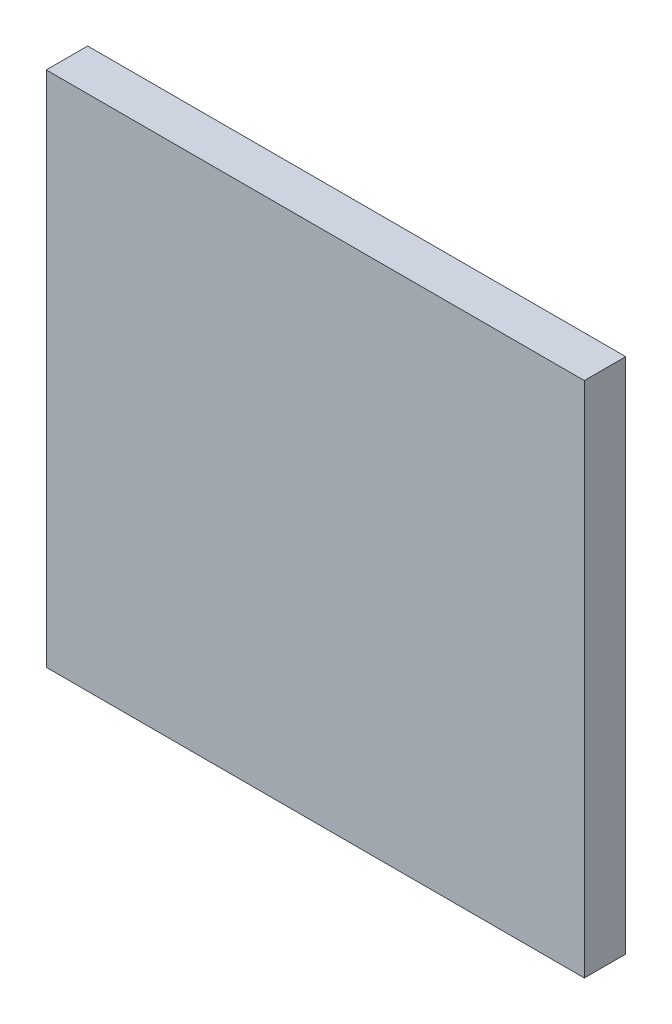
ISO-10303-21;
HEADER;
FILE_DESCRIPTION(('STEP AP214'),'2;1');
FILE_NAME('part.step','',(''),(''),'','','');
FILE_SCHEMA(('AUTOMOTIVE_DESIGN { 1 0 10303 214 1 1 1 1 }'));
ENDSEC;
DATA;
#1=APPLICATION_CONTEXT('core data for automotive mechanical design processes');
#2=APPLICATION_PROTOCOL_DEFINITION('international standard','automotive_design',2000,#1);
#3=PRODUCT_CONTEXT('',#1,'mechanical');
#4=PRODUCT('Part','Part','',(#3));
#5=PRODUCT_RELATED_PRODUCT_CATEGORY('part','',(#4));
#6=PRODUCT_DEFINITION_FORMATION('','',#4);
#7=PRODUCT_DEFINITION_CONTEXT('part definition',#1,'design');
#8=PRODUCT_DEFINITION('design','',#6,#7);
#9=PRODUCT_DEFINITION_SHAPE('','',#8);
#10=(LENGTH_UNIT() NAMED_UNIT(*) SI_UNIT(.MILLI.,.METRE.));
#11=(NAMED_UNIT(*) PLANE_ANGLE_UNIT() SI_UNIT($,.RADIAN.));
#12=(NAMED_UNIT(*) SI_UNIT($,.STERADIAN.) SOLID_ANGLE_UNIT());
#13=UNCERTAINTY_MEASURE_WITH_UNIT(LENGTH_MEASURE(1.E-05),#10,'distance_accuracy_value','');
#14=(GEOMETRIC_REPRESENTATION_CONTEXT(3) GLOBAL_UNCERTAINTY_ASSIGNED_CONTEXT((#13)) GLOBAL_UNIT_ASSIGNED_CONTEXT((#10,
#11,#12)) REPRESENTATION_CONTEXT('',''));
#15=CARTESIAN_POINT('',(0.,0.,0.));
#16=DIRECTION('',(0.,0.,1.));
#17=DIRECTION('',(1.,0.,0.));
#18=AXIS2_PLACEMENT_3D('',#15,#16,#17);
#19=CARTESIAN_POINT('',(0.,0.,4.));
#20=DIRECTION('',(1.,0.,0.));
#21=DIRECTION('',(0.,1.,0.));
#22=AXIS2_PLACEMENT_3D('',#19,#20,#21);
#23=PLANE('',#22);
#24=DIRECTION('',(0.,-1.,0.));
#25=VECTOR('',#24,1.);
#26=CARTESIAN_POINT('',(0.,0.,0.));
#27=LINE('',#26,#25);
#28=CARTESIAN_POINT('',(0.,0.,0.));
#29=VERTEX_POINT('',#28);
#30=CARTESIAN_POINT('',(0.,-50.,0.));
#31=VERTEX_POINT('',#30);
#32=EDGE_CURVE('E113',#29,#31,#27,.T.);
#33=ORIENTED_EDGE('',*,*,#32,.T.);
#34=DIRECTION('',(0.,0.,-1.));
#35=VECTOR('',#34,1.);
#36=CARTESIAN_POINT('',(0.,-50.,4.));
#37=LINE('',#36,#35);
#38=CARTESIAN_POINT('',(0.,-50.,4.));
#39=VERTEX_POINT('',#38);
#40=EDGE_CURVE('E11',#39,#31,#37,.T.);
#41=ORIENTED_EDGE('',*,*,#40,.F.);
#42=DIRECTION('',(0.,-1.,0.));
#43=VECTOR('',#42,1.);
#44=CARTESIAN_POINT('',(0.,0.,4.));
#45=LINE('',#44,#43);
#46=CARTESIAN_POINT('',(0.,0.,4.));
#47=VERTEX_POINT('',#46);
#48=EDGE_CURVE('E97',#47,#39,#45,.T.);
#49=ORIENTED_EDGE('',*,*,#48,.F.);
#50=DIRECTION('',(0.,0.,-1.));
#51=VECTOR('',#50,1.);
#52=CARTESIAN_POINT('',(0.,0.,4.));
#53=LINE('',#52,#51);
#54=EDGE_CURVE('E109',#47,#29,#53,.T.);
#55=ORIENTED_EDGE('',*,*,#54,.T.);
#56=EDGE_LOOP('',(#33,#41,#49,#55));
#57=FACE_BOUND('',#56,.T.);
#58=ADVANCED_FACE('F45',(#57),#23,.F.);
#59=CARTESIAN_POINT('',(0.,-50.,4.));
#60=DIRECTION('',(0.,1.,0.));
#61=DIRECTION('',(0.,0.,1.));
#62=AXIS2_PLACEMENT_3D('',#59,#60,#61);
#63=PLANE('',#62);
#64=DIRECTION('',(1.,0.,0.));
#65=VECTOR('',#64,1.);
#66=CARTESIAN_POINT('',(0.,-50.,0.));
#67=LINE('',#66,#65);
#68=CARTESIAN_POINT('',(52.,-50.,0.));
#69=VERTEX_POINT('',#68);
#70=EDGE_CURVE('E102',#31,#69,#67,.T.);
#71=ORIENTED_EDGE('',*,*,#70,.T.);
#72=DIRECTION('',(0.,0.,-1.));
#73=VECTOR('',#72,1.);
#74=CARTESIAN_POINT('',(52.,-50.,4.));
#75=LINE('',#74,#73);
#76=CARTESIAN_POINT('',(52.,-50.,4.));
#77=VERTEX_POINT('',#76);
#78=EDGE_CURVE('E54',#77,#69,#75,.T.);
#79=ORIENTED_EDGE('',*,*,#78,.F.);
#80=DIRECTION('',(1.,0.,0.));
#81=VECTOR('',#80,1.);
#82=CARTESIAN_POINT('',(0.,-50.,4.));
#83=LINE('',#82,#81);
#84=EDGE_CURVE('E92',#39,#77,#83,.T.);
#85=ORIENTED_EDGE('',*,*,#84,.F.);
#86=ORIENTED_EDGE('',*,*,#40,.T.);
#87=EDGE_LOOP('',(#71,#79,#85,#86));
#88=FACE_BOUND('',#87,.T.);
#89=ADVANCED_FACE('F101',(#88),#63,.F.);
#90=CARTESIAN_POINT('',(52.,0.,4.));
#91=DIRECTION('',(-1.,0.,0.));
#92=DIRECTION('',(0.,-1.,0.));
#93=AXIS2_PLACEMENT_3D('',#90,#91,#92);
#94=PLANE('',#93);
#95=DIRECTION('',(0.,1.,0.));
#96=VECTOR('',#95,1.);
#97=CARTESIAN_POINT('',(52.,0.,0.));
#98=LINE('',#97,#96);
#99=CARTESIAN_POINT('',(52.,0.,0.));
#100=VERTEX_POINT('',#99);
#101=EDGE_CURVE('E79',#69,#100,#98,.T.);
#102=ORIENTED_EDGE('',*,*,#101,.T.);
#103=DIRECTION('',(0.,0.,-1.));
#104=VECTOR('',#103,1.);
#105=CARTESIAN_POINT('',(52.,0.,4.));
#106=LINE('',#105,#104);
#107=CARTESIAN_POINT('',(52.,0.,4.));
#108=VERTEX_POINT('',#107);
#109=EDGE_CURVE('E104',#108,#100,#106,.T.);
#110=ORIENTED_EDGE('',*,*,#109,.F.);
#111=DIRECTION('',(0.,1.,0.));
#112=VECTOR('',#111,1.);
#113=CARTESIAN_POINT('',(52.,0.,4.));
#114=LINE('',#113,#112);
#115=EDGE_CURVE('E95',#77,#108,#114,.T.);
#116=ORIENTED_EDGE('',*,*,#115,.F.);
#117=ORIENTED_EDGE('',*,*,#78,.T.);
#118=EDGE_LOOP('',(#102,#110,#116,#117));
#119=FACE_BOUND('',#118,.T.);
#120=ADVANCED_FACE('F105',(#119),#94,.F.);
#121=CARTESIAN_POINT('',(0.,0.,4.));
#122=DIRECTION('',(0.,-1.,0.));
#123=DIRECTION('',(0.,0.,-1.));
#124=AXIS2_PLACEMENT_3D('',#121,#122,#123);
#125=PLANE('',#124);
#126=DIRECTION('',(-1.,0.,0.));
#127=VECTOR('',#126,1.);
#128=CARTESIAN_POINT('',(0.,0.,0.));
#129=LINE('',#128,#127);
#130=EDGE_CURVE('E85',#100,#29,#129,.T.);
#131=ORIENTED_EDGE('',*,*,#130,.T.);
#132=ORIENTED_EDGE('',*,*,#54,.F.);
#133=DIRECTION('',(-1.,0.,0.));
#134=VECTOR('',#133,1.);
#135=CARTESIAN_POINT('',(0.,0.,4.));
#136=LINE('',#135,#134);
#137=EDGE_CURVE('E62',#108,#47,#136,.T.);
#138=ORIENTED_EDGE('',*,*,#137,.F.);
#139=ORIENTED_EDGE('',*,*,#109,.T.);
#140=EDGE_LOOP('',(#131,#132,#138,#139));
#141=FACE_BOUND('',#140,.T.);
#142=ADVANCED_FACE('F126',(#141),#125,.F.);
#143=CARTESIAN_POINT('',(0.,0.,4.));
#144=DIRECTION('',(0.,0.,1.));
#145=DIRECTION('',(1.,0.,0.));
#146=AXIS2_PLACEMENT_3D('',#143,#144,#145);
#147=PLANE('',#146);
#148=ORIENTED_EDGE('',*,*,#48,.T.);
#149=ORIENTED_EDGE('',*,*,#84,.T.);
#150=ORIENTED_EDGE('',*,*,#115,.T.);
#151=ORIENTED_EDGE('',*,*,#137,.T.);
#152=EDGE_LOOP('',(#148,#149,#150,#151));
#153=FACE_BOUND('',#152,.T.);
#154=ADVANCED_FACE('F93',(#153),#147,.T.);
#155=CARTESIAN_POINT('',(0.,0.,0.));
#156=DIRECTION('',(0.,0.,1.));
#157=DIRECTION('',(1.,0.,0.));
#158=AXIS2_PLACEMENT_3D('',#155,#156,#157);
#159=PLANE('',#158);
#160=ORIENTED_EDGE('',*,*,#32,.F.);
#161=ORIENTED_EDGE('',*,*,#130,.F.);
#162=ORIENTED_EDGE('',*,*,#101,.F.);
#163=ORIENTED_EDGE('',*,*,#70,.F.);
#164=EDGE_LOOP('',(#160,#161,#162,#163));
#165=FACE_BOUND('',#164,.T.);
#166=ADVANCED_FACE('F129',(#165),#159,.F.);
#167=CLOSED_SHELL('',(#58,#89,#120,#142,#154,#166));
#168=MANIFOLD_SOLID_BREP('B2',#167);
#169=ADVANCED_BREP_SHAPE_REPRESENTATION('',(#18,#168),#14);
#170=SHAPE_DEFINITION_REPRESENTATION(#9,#169);
ENDSEC;
END-ISO-10303-21;
